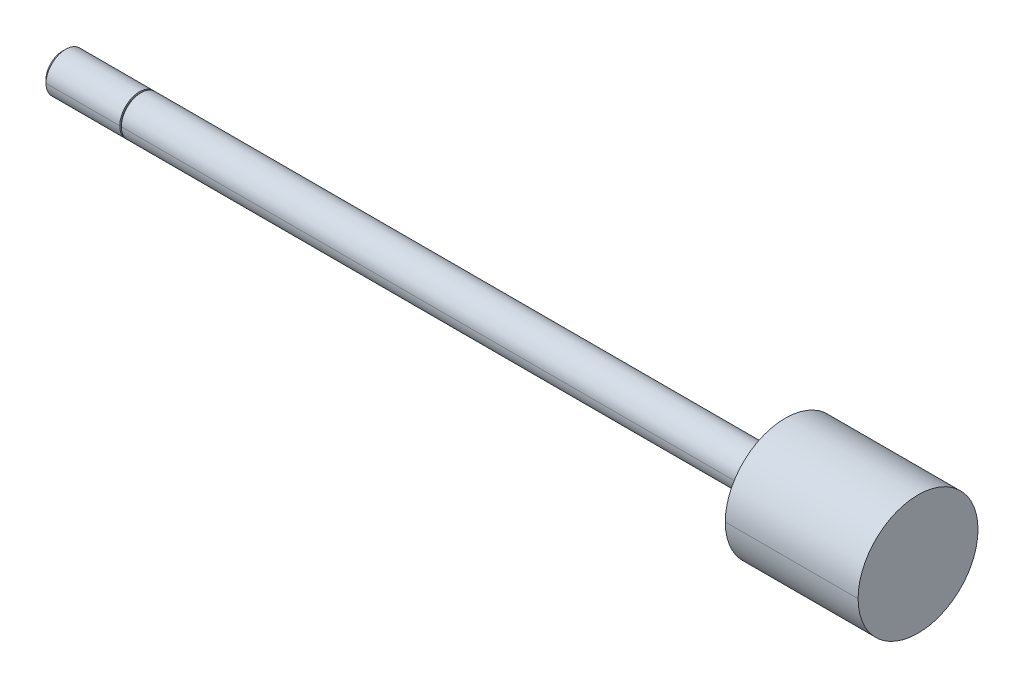
ISO-10303-21;
HEADER;
FILE_DESCRIPTION(('STEP AP214'),'2;1');
FILE_NAME('part.step','',(''),(''),'','','');
FILE_SCHEMA(('AUTOMOTIVE_DESIGN { 1 0 10303 214 1 1 1 1 }'));
ENDSEC;
DATA;
#1=APPLICATION_CONTEXT('core data for automotive mechanical design processes');
#2=APPLICATION_PROTOCOL_DEFINITION('international standard','automotive_design',2000,#1);
#3=PRODUCT_CONTEXT('',#1,'mechanical');
#4=PRODUCT('Part','Part','',(#3));
#5=PRODUCT_RELATED_PRODUCT_CATEGORY('part','',(#4));
#6=PRODUCT_DEFINITION_FORMATION('','',#4);
#7=PRODUCT_DEFINITION_CONTEXT('part definition',#1,'design');
#8=PRODUCT_DEFINITION('design','',#6,#7);
#9=PRODUCT_DEFINITION_SHAPE('','',#8);
#10=(LENGTH_UNIT() NAMED_UNIT(*) SI_UNIT(.MILLI.,.METRE.));
#11=(NAMED_UNIT(*) PLANE_ANGLE_UNIT() SI_UNIT($,.RADIAN.));
#12=(NAMED_UNIT(*) SI_UNIT($,.STERADIAN.) SOLID_ANGLE_UNIT());
#13=UNCERTAINTY_MEASURE_WITH_UNIT(LENGTH_MEASURE(1.E-05),#10,'distance_accuracy_value','');
#14=(GEOMETRIC_REPRESENTATION_CONTEXT(3) GLOBAL_UNCERTAINTY_ASSIGNED_CONTEXT((#13)) GLOBAL_UNIT_ASSIGNED_CONTEXT((#10,
#11,#12)) REPRESENTATION_CONTEXT('',''));
#15=CARTESIAN_POINT('',(0.,0.,0.));
#16=DIRECTION('',(0.,0.,1.));
#17=DIRECTION('',(1.,0.,0.));
#18=AXIS2_PLACEMENT_3D('',#15,#16,#17);
#19=CARTESIAN_POINT('',(138.1252,0.,0.));
#20=DIRECTION('',(-1.,0.,0.));
#21=DIRECTION('',(0.,-1.,0.));
#22=AXIS2_PLACEMENT_3D('',#19,#20,#21);
#23=CYLINDRICAL_SURFACE('',#22,9.6774);
#24=CARTESIAN_POINT('',(138.1252,0.,0.));
#25=DIRECTION('',(1.,0.,0.));
#26=DIRECTION('',(0.,0.,-1.));
#27=AXIS2_PLACEMENT_3D('',#24,#25,#26);
#28=CIRCLE('',#27,9.6774);
#29=CARTESIAN_POINT('',(138.1252,0.,-9.6774));
#30=VERTEX_POINT('',#29);
#31=CARTESIAN_POINT('',(138.1252,0.,9.6774));
#32=VERTEX_POINT('',#31);
#33=EDGE_CURVE('E11',#30,#32,#28,.T.);
#34=ORIENTED_EDGE('',*,*,#33,.F.);
#35=CARTESIAN_POINT('',(138.1252,0.,-9.6774));
#36=DIRECTION('',(-1.,0.,0.));
#37=VECTOR('',#36,1.);
#38=LINE('',#35,#37);
#39=CARTESIAN_POINT('',(116.6876,0.,-9.6774));
#40=VERTEX_POINT('',#39);
#41=EDGE_CURVE('E26',#30,#40,#38,.T.);
#42=ORIENTED_EDGE('',*,*,#41,.T.);
#43=CARTESIAN_POINT('',(116.6876,0.,0.));
#44=DIRECTION('',(1.,0.,0.));
#45=DIRECTION('',(0.,0.,-1.));
#46=AXIS2_PLACEMENT_3D('',#43,#44,#45);
#47=CIRCLE('',#46,9.6774);
#48=CARTESIAN_POINT('',(116.6876,0.,9.6774));
#49=VERTEX_POINT('',#48);
#50=EDGE_CURVE('E399',#40,#49,#47,.T.);
#51=ORIENTED_EDGE('',*,*,#50,.T.);
#52=CARTESIAN_POINT('',(138.1252,0.,9.6774));
#53=DIRECTION('',(-1.,0.,0.));
#54=VECTOR('',#53,1.);
#55=LINE('',#52,#54);
#56=EDGE_CURVE('E387',#32,#49,#55,.T.);
#57=ORIENTED_EDGE('',*,*,#56,.F.);
#58=EDGE_LOOP('',(#34,#42,#51,#57));
#59=FACE_BOUND('',#58,.T.);
#60=ADVANCED_FACE('F17',(#59),#23,.T.);
#61=CARTESIAN_POINT('',(138.1252,0.,0.));
#62=DIRECTION('',(-1.,0.,0.));
#63=DIRECTION('',(0.,1.,0.));
#64=AXIS2_PLACEMENT_3D('',#61,#62,#63);
#65=CYLINDRICAL_SURFACE('',#64,9.6774);
#66=CARTESIAN_POINT('',(116.6876,0.,0.));
#67=DIRECTION('',(1.,0.,0.));
#68=DIRECTION('',(0.,0.,-1.));
#69=AXIS2_PLACEMENT_3D('',#66,#67,#68);
#70=CIRCLE('',#69,9.6774);
#71=EDGE_CURVE('E385',#49,#40,#70,.T.);
#72=ORIENTED_EDGE('',*,*,#71,.T.);
#73=ORIENTED_EDGE('',*,*,#41,.F.);
#74=CARTESIAN_POINT('',(138.1252,0.,0.));
#75=DIRECTION('',(1.,0.,0.));
#76=DIRECTION('',(0.,0.,-1.));
#77=AXIS2_PLACEMENT_3D('',#74,#75,#76);
#78=CIRCLE('',#77,9.6774);
#79=EDGE_CURVE('E351',#32,#30,#78,.T.);
#80=ORIENTED_EDGE('',*,*,#79,.F.);
#81=ORIENTED_EDGE('',*,*,#56,.T.);
#82=EDGE_LOOP('',(#72,#73,#80,#81));
#83=FACE_BOUND('',#82,.T.);
#84=ADVANCED_FACE('F359',(#83),#65,.T.);
#85=CARTESIAN_POINT('',(138.1252,3.175,0.));
#86=DIRECTION('',(-1.,0.,0.));
#87=DIRECTION('',(0.,0.,1.));
#88=AXIS2_PLACEMENT_3D('',#85,#86,#87);
#89=PLANE('',#88);
#90=ORIENTED_EDGE('',*,*,#33,.T.);
#91=ORIENTED_EDGE('',*,*,#79,.T.);
#92=EDGE_LOOP('',(#90,#91));
#93=FACE_BOUND('',#92,.T.);
#94=ADVANCED_FACE('F368',(#93),#89,.F.);
#95=CARTESIAN_POINT('',(116.6876,0.,0.));
#96=DIRECTION('',(1.,0.,0.));
#97=DIRECTION('',(0.,0.,-1.));
#98=AXIS2_PLACEMENT_3D('',#95,#96,#97);
#99=PLANE('',#98);
#100=ORIENTED_EDGE('',*,*,#50,.F.);
#101=ORIENTED_EDGE('',*,*,#71,.F.);
#102=EDGE_LOOP('',(#100,#101));
#103=FACE_BOUND('',#102,.T.);
#104=CARTESIAN_POINT('',(116.6876,0.,0.));
#105=DIRECTION('',(1.,0.,0.));
#106=DIRECTION('',(0.,0.,-1.));
#107=AXIS2_PLACEMENT_3D('',#104,#105,#106);
#108=CIRCLE('',#107,3.175);
#109=CARTESIAN_POINT('',(116.6876,0.,-3.175));
#110=VERTEX_POINT('',#109);
#111=CARTESIAN_POINT('',(116.6876,0.,3.175));
#112=VERTEX_POINT('',#111);
#113=EDGE_CURVE('E347',#110,#112,#108,.T.);
#114=ORIENTED_EDGE('',*,*,#113,.T.);
#115=CARTESIAN_POINT('',(116.6876,0.,0.));
#116=DIRECTION('',(1.,0.,0.));
#117=DIRECTION('',(0.,0.,-1.));
#118=AXIS2_PLACEMENT_3D('',#115,#116,#117);
#119=CIRCLE('',#118,3.175);
#120=EDGE_CURVE('E343',#112,#110,#119,.T.);
#121=ORIENTED_EDGE('',*,*,#120,.T.);
#122=EDGE_LOOP('',(#114,#121));
#123=FACE_BOUND('',#122,.T.);
#124=ADVANCED_FACE('F413',(#103,#123),#99,.F.);
#125=CARTESIAN_POINT('',(138.1252,0.,0.));
#126=DIRECTION('',(-1.,0.,0.));
#127=DIRECTION('',(0.,1.,0.));
#128=AXIS2_PLACEMENT_3D('',#125,#126,#127);
#129=CYLINDRICAL_SURFACE('',#128,3.175);
#130=CARTESIAN_POINT('',(12.7,0.,0.));
#131=DIRECTION('',(1.,0.,0.));
#132=DIRECTION('',(0.,0.,-1.));
#133=AXIS2_PLACEMENT_3D('',#130,#131,#132);
#134=CIRCLE('',#133,3.175);
#135=CARTESIAN_POINT('',(12.7,0.,3.175));
#136=VERTEX_POINT('',#135);
#137=CARTESIAN_POINT('',(12.7,0.,-3.175));
#138=VERTEX_POINT('',#137);
#139=EDGE_CURVE('E341',#136,#138,#134,.T.);
#140=ORIENTED_EDGE('',*,*,#139,.T.);
#141=CARTESIAN_POINT('',(116.6876,0.,-3.175));
#142=DIRECTION('',(-1.,0.,0.));
#143=VECTOR('',#142,1.);
#144=LINE('',#141,#143);
#145=EDGE_CURVE('E318',#110,#138,#144,.T.);
#146=ORIENTED_EDGE('',*,*,#145,.F.);
#147=ORIENTED_EDGE('',*,*,#120,.F.);
#148=CARTESIAN_POINT('',(116.6876,0.,3.175));
#149=DIRECTION('',(-1.,0.,0.));
#150=VECTOR('',#149,1.);
#151=LINE('',#148,#150);
#152=EDGE_CURVE('E331',#112,#136,#151,.T.);
#153=ORIENTED_EDGE('',*,*,#152,.T.);
#154=EDGE_LOOP('',(#140,#146,#147,#153));
#155=FACE_BOUND('',#154,.T.);
#156=ADVANCED_FACE('F297',(#155),#129,.T.);
#157=CARTESIAN_POINT('',(138.1252,0.,0.));
#158=DIRECTION('',(-1.,0.,0.));
#159=DIRECTION('',(0.,-1.,0.));
#160=AXIS2_PLACEMENT_3D('',#157,#158,#159);
#161=CYLINDRICAL_SURFACE('',#160,3.175);
#162=ORIENTED_EDGE('',*,*,#113,.F.);
#163=ORIENTED_EDGE('',*,*,#145,.T.);
#164=CARTESIAN_POINT('',(12.7,0.,0.));
#165=DIRECTION('',(1.,0.,0.));
#166=DIRECTION('',(0.,0.,-1.));
#167=AXIS2_PLACEMENT_3D('',#164,#165,#166);
#168=CIRCLE('',#167,3.175);
#169=EDGE_CURVE('E278',#138,#136,#168,.T.);
#170=ORIENTED_EDGE('',*,*,#169,.T.);
#171=ORIENTED_EDGE('',*,*,#152,.F.);
#172=EDGE_LOOP('',(#162,#163,#170,#171));
#173=FACE_BOUND('',#172,.T.);
#174=ADVANCED_FACE('F287',(#173),#161,.T.);
#175=CARTESIAN_POINT('',(12.7,0.,0.));
#176=DIRECTION('',(1.,0.,0.));
#177=DIRECTION('',(0.,0.,-1.));
#178=AXIS2_PLACEMENT_3D('',#175,#176,#177);
#179=PLANE('',#178);
#180=ORIENTED_EDGE('',*,*,#169,.F.);
#181=ORIENTED_EDGE('',*,*,#139,.F.);
#182=EDGE_LOOP('',(#180,#181));
#183=FACE_BOUND('',#182,.T.);
#184=CARTESIAN_POINT('',(12.7,0.,0.));
#185=DIRECTION('',(1.,0.,0.));
#186=DIRECTION('',(0.,0.,-1.));
#187=AXIS2_PLACEMENT_3D('',#184,#185,#186);
#188=CIRCLE('',#187,2.921);
#189=CARTESIAN_POINT('',(12.7,0.,-2.921));
#190=VERTEX_POINT('',#189);
#191=CARTESIAN_POINT('',(12.7,0.,2.921));
#192=VERTEX_POINT('',#191);
#193=EDGE_CURVE('E274',#190,#192,#188,.T.);
#194=ORIENTED_EDGE('',*,*,#193,.T.);
#195=CARTESIAN_POINT('',(12.7,0.,0.));
#196=DIRECTION('',(1.,0.,0.));
#197=DIRECTION('',(0.,0.,-1.));
#198=AXIS2_PLACEMENT_3D('',#195,#196,#197);
#199=CIRCLE('',#198,2.921);
#200=EDGE_CURVE('E270',#192,#190,#199,.T.);
#201=ORIENTED_EDGE('',*,*,#200,.T.);
#202=EDGE_LOOP('',(#194,#201));
#203=FACE_BOUND('',#202,.T.);
#204=ADVANCED_FACE('F296',(#183,#203),#179,.F.);
#205=CARTESIAN_POINT('',(12.7,0.,0.));
#206=DIRECTION('',(-1.,0.,0.));
#207=DIRECTION('',(0.,1.,0.));
#208=AXIS2_PLACEMENT_3D('',#205,#206,#207);
#209=CYLINDRICAL_SURFACE('',#208,2.921);
#210=CARTESIAN_POINT('',(12.446,0.,0.));
#211=DIRECTION('',(1.,0.,0.));
#212=DIRECTION('',(0.,0.,-1.));
#213=AXIS2_PLACEMENT_3D('',#210,#211,#212);
#214=CIRCLE('',#213,2.921);
#215=CARTESIAN_POINT('',(12.446,0.,2.921));
#216=VERTEX_POINT('',#215);
#217=CARTESIAN_POINT('',(12.446,0.,-2.921));
#218=VERTEX_POINT('',#217);
#219=EDGE_CURVE('E268',#216,#218,#214,.T.);
#220=ORIENTED_EDGE('',*,*,#219,.T.);
#221=CARTESIAN_POINT('',(12.7,0.,-2.921));
#222=DIRECTION('',(-1.,0.,0.));
#223=VECTOR('',#222,1.);
#224=LINE('',#221,#223);
#225=EDGE_CURVE('E245',#190,#218,#224,.T.);
#226=ORIENTED_EDGE('',*,*,#225,.F.);
#227=ORIENTED_EDGE('',*,*,#200,.F.);
#228=CARTESIAN_POINT('',(12.7,0.,2.921));
#229=DIRECTION('',(-1.,0.,0.));
#230=VECTOR('',#229,1.);
#231=LINE('',#228,#230);
#232=EDGE_CURVE('E258',#192,#216,#231,.T.);
#233=ORIENTED_EDGE('',*,*,#232,.T.);
#234=EDGE_LOOP('',(#220,#226,#227,#233));
#235=FACE_BOUND('',#234,.T.);
#236=ADVANCED_FACE('F224',(#235),#209,.T.);
#237=CARTESIAN_POINT('',(12.7,0.,0.));
#238=DIRECTION('',(-1.,0.,0.));
#239=DIRECTION('',(0.,-1.,0.));
#240=AXIS2_PLACEMENT_3D('',#237,#238,#239);
#241=CYLINDRICAL_SURFACE('',#240,2.921);
#242=ORIENTED_EDGE('',*,*,#193,.F.);
#243=ORIENTED_EDGE('',*,*,#225,.T.);
#244=CARTESIAN_POINT('',(12.446,0.,0.));
#245=DIRECTION('',(1.,0.,0.));
#246=DIRECTION('',(0.,0.,-1.));
#247=AXIS2_PLACEMENT_3D('',#244,#245,#246);
#248=CIRCLE('',#247,2.921);
#249=EDGE_CURVE('E207',#218,#216,#248,.T.);
#250=ORIENTED_EDGE('',*,*,#249,.T.);
#251=ORIENTED_EDGE('',*,*,#232,.F.);
#252=EDGE_LOOP('',(#242,#243,#250,#251));
#253=FACE_BOUND('',#252,.T.);
#254=ADVANCED_FACE('F215',(#253),#241,.T.);
#255=CARTESIAN_POINT('',(12.446,3.175,0.));
#256=DIRECTION('',(-1.,0.,0.));
#257=DIRECTION('',(0.,0.,1.));
#258=AXIS2_PLACEMENT_3D('',#255,#256,#257);
#259=PLANE('',#258);
#260=ORIENTED_EDGE('',*,*,#249,.F.);
#261=ORIENTED_EDGE('',*,*,#219,.F.);
#262=EDGE_LOOP('',(#260,#261));
#263=FACE_BOUND('',#262,.T.);
#264=CARTESIAN_POINT('',(12.446,0.,0.));
#265=DIRECTION('',(1.,0.,0.));
#266=DIRECTION('',(0.,0.,-1.));
#267=AXIS2_PLACEMENT_3D('',#264,#265,#266);
#268=CIRCLE('',#267,3.175);
#269=CARTESIAN_POINT('',(12.446,0.,-3.175));
#270=VERTEX_POINT('',#269);
#271=CARTESIAN_POINT('',(12.446,0.,3.175));
#272=VERTEX_POINT('',#271);
#273=EDGE_CURVE('E203',#270,#272,#268,.T.);
#274=ORIENTED_EDGE('',*,*,#273,.T.);
#275=CARTESIAN_POINT('',(12.446,0.,0.));
#276=DIRECTION('',(1.,0.,0.));
#277=DIRECTION('',(0.,0.,-1.));
#278=AXIS2_PLACEMENT_3D('',#275,#276,#277);
#279=CIRCLE('',#278,3.175);
#280=EDGE_CURVE('E199',#272,#270,#279,.T.);
#281=ORIENTED_EDGE('',*,*,#280,.T.);
#282=EDGE_LOOP('',(#274,#281));
#283=FACE_BOUND('',#282,.T.);
#284=ADVANCED_FACE('F184',(#263,#283),#259,.F.);
#285=CARTESIAN_POINT('',(12.7,0.,0.));
#286=DIRECTION('',(-1.,0.,0.));
#287=DIRECTION('',(0.,1.,0.));
#288=AXIS2_PLACEMENT_3D('',#285,#286,#287);
#289=CYLINDRICAL_SURFACE('',#288,3.175);
#290=CARTESIAN_POINT('',(0.54102,0.,0.));
#291=DIRECTION('',(1.,0.,0.));
#292=DIRECTION('',(0.,0.,-1.));
#293=AXIS2_PLACEMENT_3D('',#290,#291,#292);
#294=CIRCLE('',#293,3.175);
#295=CARTESIAN_POINT('',(0.54102,0.,3.175));
#296=VERTEX_POINT('',#295);
#297=CARTESIAN_POINT('',(0.54102,0.,-3.175));
#298=VERTEX_POINT('',#297);
#299=EDGE_CURVE('E103',#296,#298,#294,.T.);
#300=ORIENTED_EDGE('',*,*,#299,.T.);
#301=CARTESIAN_POINT('',(12.446,0.,-3.175));
#302=DIRECTION('',(-1.,0.,0.));
#303=VECTOR('',#302,1.);
#304=LINE('',#301,#303);
#305=EDGE_CURVE('E170',#270,#298,#304,.T.);
#306=ORIENTED_EDGE('',*,*,#305,.F.);
#307=ORIENTED_EDGE('',*,*,#280,.F.);
#308=CARTESIAN_POINT('',(12.446,0.,3.175));
#309=DIRECTION('',(-1.,0.,0.));
#310=VECTOR('',#309,1.);
#311=LINE('',#308,#310);
#312=EDGE_CURVE('E154',#272,#296,#311,.T.);
#313=ORIENTED_EDGE('',*,*,#312,.T.);
#314=EDGE_LOOP('',(#300,#306,#307,#313));
#315=FACE_BOUND('',#314,.T.);
#316=ADVANCED_FACE('F175',(#315),#289,.T.);
#317=CARTESIAN_POINT('',(12.7,0.,0.));
#318=DIRECTION('',(-1.,0.,0.));
#319=DIRECTION('',(0.,-1.,0.));
#320=AXIS2_PLACEMENT_3D('',#317,#318,#319);
#321=CYLINDRICAL_SURFACE('',#320,3.175);
#322=ORIENTED_EDGE('',*,*,#273,.F.);
#323=ORIENTED_EDGE('',*,*,#305,.T.);
#324=CARTESIAN_POINT('',(0.54102,0.,0.));
#325=DIRECTION('',(1.,0.,0.));
#326=DIRECTION('',(0.,0.,-1.));
#327=AXIS2_PLACEMENT_3D('',#324,#325,#326);
#328=CIRCLE('',#327,3.175);
#329=EDGE_CURVE('E155',#298,#296,#328,.T.);
#330=ORIENTED_EDGE('',*,*,#329,.T.);
#331=ORIENTED_EDGE('',*,*,#312,.F.);
#332=EDGE_LOOP('',(#322,#323,#330,#331));
#333=FACE_BOUND('',#332,.T.);
#334=ADVANCED_FACE('F124',(#333),#321,.T.);
#335=CARTESIAN_POINT('',(0.,0.,0.));
#336=DIRECTION('',(1.,0.,0.));
#337=DIRECTION('',(0.,-1.,0.));
#338=AXIS2_PLACEMENT_3D('',#335,#336,#337);
#339=CONICAL_SURFACE('',#338,2.63398,0.785398163397448);
#340=ORIENTED_EDGE('',*,*,#329,.F.);
#341=CARTESIAN_POINT('',(0.,0.,-2.63398));
#342=DIRECTION('',(0.707106781186548,0.,-0.707106781186547));
#343=VECTOR('',#342,1.);
#344=LINE('',#341,#343);
#345=CARTESIAN_POINT('',(0.,0.,-2.63398));
#346=VERTEX_POINT('',#345);
#347=EDGE_CURVE('E93',#346,#298,#344,.T.);
#348=ORIENTED_EDGE('',*,*,#347,.F.);
#349=CARTESIAN_POINT('',(0.,0.,0.));
#350=DIRECTION('',(1.,0.,0.));
#351=DIRECTION('',(0.,0.,-1.));
#352=AXIS2_PLACEMENT_3D('',#349,#350,#351);
#353=CIRCLE('',#352,2.63398);
#354=CARTESIAN_POINT('',(0.,0.,2.63398));
#355=VERTEX_POINT('',#354);
#356=EDGE_CURVE('E85',#346,#355,#353,.T.);
#357=ORIENTED_EDGE('',*,*,#356,.T.);
#358=CARTESIAN_POINT('',(0.,0.,2.63398));
#359=DIRECTION('',(0.707106781186548,0.,0.707106781186547));
#360=VECTOR('',#359,1.);
#361=LINE('',#358,#360);
#362=EDGE_CURVE('E89',#355,#296,#361,.T.);
#363=ORIENTED_EDGE('',*,*,#362,.T.);
#364=EDGE_LOOP('',(#340,#348,#357,#363));
#365=FACE_BOUND('',#364,.T.);
#366=ADVANCED_FACE('F88',(#365),#339,.T.);
#367=CARTESIAN_POINT('',(0.,0.,0.));
#368=DIRECTION('',(1.,0.,0.));
#369=DIRECTION('',(0.,1.,0.));
#370=AXIS2_PLACEMENT_3D('',#367,#368,#369);
#371=CONICAL_SURFACE('',#370,2.63398,0.785398163397448);
#372=CARTESIAN_POINT('',(0.,0.,0.));
#373=DIRECTION('',(1.,0.,0.));
#374=DIRECTION('',(0.,0.,-1.));
#375=AXIS2_PLACEMENT_3D('',#372,#373,#374);
#376=CIRCLE('',#375,2.63398);
#377=EDGE_CURVE('E102',#355,#346,#376,.T.);
#378=ORIENTED_EDGE('',*,*,#377,.T.);
#379=ORIENTED_EDGE('',*,*,#347,.T.);
#380=ORIENTED_EDGE('',*,*,#299,.F.);
#381=ORIENTED_EDGE('',*,*,#362,.F.);
#382=EDGE_LOOP('',(#378,#379,#380,#381));
#383=FACE_BOUND('',#382,.T.);
#384=ADVANCED_FACE('F101',(#383),#371,.T.);
#385=CARTESIAN_POINT('',(0.,0.,0.));
#386=DIRECTION('',(1.,0.,0.));
#387=DIRECTION('',(0.,0.,-1.));
#388=AXIS2_PLACEMENT_3D('',#385,#386,#387);
#389=PLANE('',#388);
#390=ORIENTED_EDGE('',*,*,#356,.F.);
#391=ORIENTED_EDGE('',*,*,#377,.F.);
#392=EDGE_LOOP('',(#390,#391));
#393=FACE_BOUND('',#392,.T.);
#394=ADVANCED_FACE('F106',(#393),#389,.F.);
#395=CLOSED_SHELL('',(#60,#84,#94,#124,#156,#174,#204,#236,#254,#284,#316,#334,#366,#384,#394));
#396=MANIFOLD_SOLID_BREP('B1',#395);
#397=ADVANCED_BREP_SHAPE_REPRESENTATION('',(#18,#396),#14);
#398=SHAPE_DEFINITION_REPRESENTATION(#9,#397);
ENDSEC;
END-ISO-10303-21;
